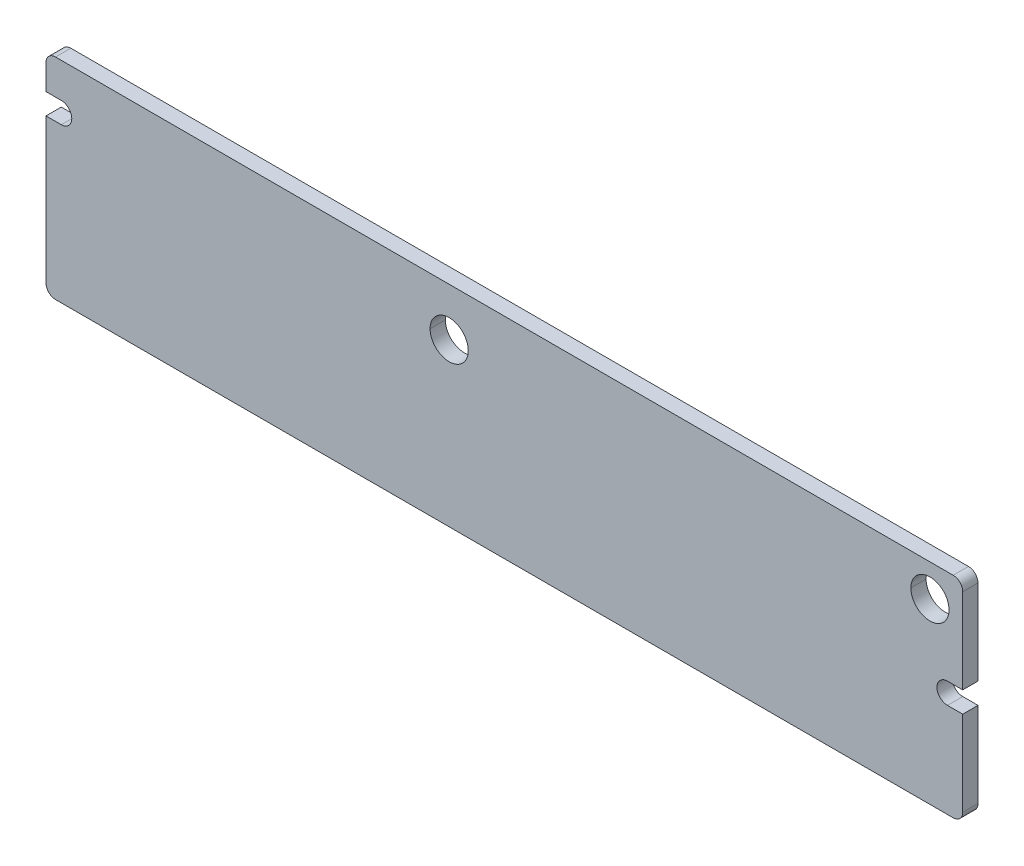
ISO-10303-21;
HEADER;
FILE_DESCRIPTION(('STEP AP214'),'2;1');
FILE_NAME('part.step','',(''),(''),'','','');
FILE_SCHEMA(('AUTOMOTIVE_DESIGN { 1 0 10303 214 1 1 1 1 }'));
ENDSEC;
DATA;
#1=APPLICATION_CONTEXT('core data for automotive mechanical design processes');
#2=APPLICATION_PROTOCOL_DEFINITION('international standard','automotive_design',2000,#1);
#3=PRODUCT_CONTEXT('',#1,'mechanical');
#4=PRODUCT('Part','Part','',(#3));
#5=PRODUCT_RELATED_PRODUCT_CATEGORY('part','',(#4));
#6=PRODUCT_DEFINITION_FORMATION('','',#4);
#7=PRODUCT_DEFINITION_CONTEXT('part definition',#1,'design');
#8=PRODUCT_DEFINITION('design','',#6,#7);
#9=PRODUCT_DEFINITION_SHAPE('','',#8);
#10=(LENGTH_UNIT() NAMED_UNIT(*) SI_UNIT(.MILLI.,.METRE.));
#11=(NAMED_UNIT(*) PLANE_ANGLE_UNIT() SI_UNIT($,.RADIAN.));
#12=(NAMED_UNIT(*) SI_UNIT($,.STERADIAN.) SOLID_ANGLE_UNIT());
#13=UNCERTAINTY_MEASURE_WITH_UNIT(LENGTH_MEASURE(1.E-05),#10,'distance_accuracy_value','');
#14=(GEOMETRIC_REPRESENTATION_CONTEXT(3) GLOBAL_UNCERTAINTY_ASSIGNED_CONTEXT((#13)) GLOBAL_UNIT_ASSIGNED_CONTEXT((#10,
#11,#12)) REPRESENTATION_CONTEXT('',''));
#15=CARTESIAN_POINT('',(0.,0.,0.));
#16=DIRECTION('',(0.,0.,1.));
#17=DIRECTION('',(1.,0.,0.));
#18=AXIS2_PLACEMENT_3D('',#15,#16,#17);
#19=CARTESIAN_POINT('',(0.,0.,0.));
#20=DIRECTION('',(0.,0.,1.));
#21=DIRECTION('',(1.,0.,0.));
#22=AXIS2_PLACEMENT_3D('',#19,#20,#21);
#23=CYLINDRICAL_SURFACE('',#22,1.);
#24=DIRECTION('',(0.,0.,1.));
#25=VECTOR('',#24,1.);
#26=CARTESIAN_POINT('',(-1.,0.,0.));
#27=LINE('',#26,#25);
#28=CARTESIAN_POINT('',(-1.,0.,0.));
#29=VERTEX_POINT('',#28);
#30=CARTESIAN_POINT('',(-1.,0.,0.8));
#31=VERTEX_POINT('',#30);
#32=EDGE_CURVE('E11',#29,#31,#27,.T.);
#33=ORIENTED_EDGE('',*,*,#32,.T.);
#34=CARTESIAN_POINT('',(0.,0.,0.8));
#35=DIRECTION('',(0.,0.,1.));
#36=DIRECTION('',(-1.,0.,0.));
#37=AXIS2_PLACEMENT_3D('',#34,#35,#36);
#38=CIRCLE('',#37,1.);
#39=CARTESIAN_POINT('',(1.,0.,0.8));
#40=VERTEX_POINT('',#39);
#41=EDGE_CURVE('E280',#31,#40,#38,.T.);
#42=ORIENTED_EDGE('',*,*,#41,.T.);
#43=DIRECTION('',(0.,0.,1.));
#44=VECTOR('',#43,1.);
#45=CARTESIAN_POINT('',(1.,0.,0.));
#46=LINE('',#45,#44);
#47=CARTESIAN_POINT('',(1.,0.,0.));
#48=VERTEX_POINT('',#47);
#49=EDGE_CURVE('E28',#48,#40,#46,.T.);
#50=ORIENTED_EDGE('',*,*,#49,.F.);
#51=CARTESIAN_POINT('',(0.,0.,0.));
#52=DIRECTION('',(0.,0.,1.));
#53=DIRECTION('',(-1.,0.,0.));
#54=AXIS2_PLACEMENT_3D('',#51,#52,#53);
#55=CIRCLE('',#54,1.);
#56=EDGE_CURVE('E244',#29,#48,#55,.T.);
#57=ORIENTED_EDGE('',*,*,#56,.F.);
#58=EDGE_LOOP('',(#33,#42,#50,#57));
#59=FACE_BOUND('',#58,.T.);
#60=ADVANCED_FACE('F17',(#59),#23,.F.);
#61=CARTESIAN_POINT('',(0.,0.,0.));
#62=DIRECTION('',(0.,0.,1.));
#63=DIRECTION('',(1.,0.,0.));
#64=AXIS2_PLACEMENT_3D('',#61,#62,#63);
#65=CYLINDRICAL_SURFACE('',#64,1.);
#66=ORIENTED_EDGE('',*,*,#49,.T.);
#67=CARTESIAN_POINT('',(0.,0.,0.8));
#68=DIRECTION('',(0.,0.,1.));
#69=DIRECTION('',(1.,0.,0.));
#70=AXIS2_PLACEMENT_3D('',#67,#68,#69);
#71=CIRCLE('',#70,1.);
#72=EDGE_CURVE('E267',#40,#31,#71,.T.);
#73=ORIENTED_EDGE('',*,*,#72,.T.);
#74=ORIENTED_EDGE('',*,*,#32,.F.);
#75=CARTESIAN_POINT('',(0.,0.,0.));
#76=DIRECTION('',(0.,0.,1.));
#77=DIRECTION('',(1.,0.,0.));
#78=AXIS2_PLACEMENT_3D('',#75,#76,#77);
#79=CIRCLE('',#78,1.);
#80=EDGE_CURVE('E239',#48,#29,#79,.T.);
#81=ORIENTED_EDGE('',*,*,#80,.F.);
#82=EDGE_LOOP('',(#66,#73,#74,#81));
#83=FACE_BOUND('',#82,.T.);
#84=ADVANCED_FACE('F378',(#83),#65,.F.);
#85=CARTESIAN_POINT('',(-25.173,-0.831,0.));
#86=DIRECTION('',(0.,0.,1.));
#87=DIRECTION('',(1.,0.,0.));
#88=AXIS2_PLACEMENT_3D('',#85,#86,#87);
#89=CYLINDRICAL_SURFACE('',#88,1.);
#90=DIRECTION('',(0.,0.,1.));
#91=VECTOR('',#90,1.);
#92=CARTESIAN_POINT('',(-26.173,-0.831,0.));
#93=LINE('',#92,#91);
#94=CARTESIAN_POINT('',(-26.173,-0.831,0.));
#95=VERTEX_POINT('',#94);
#96=CARTESIAN_POINT('',(-26.173,-0.831,0.8));
#97=VERTEX_POINT('',#96);
#98=EDGE_CURVE('E266',#95,#97,#93,.T.);
#99=ORIENTED_EDGE('',*,*,#98,.T.);
#100=CARTESIAN_POINT('',(-25.173,-0.831,0.8));
#101=DIRECTION('',(0.,0.,1.));
#102=DIRECTION('',(-1.,0.,0.));
#103=AXIS2_PLACEMENT_3D('',#100,#101,#102);
#104=CIRCLE('',#103,1.);
#105=CARTESIAN_POINT('',(-24.173,-0.831,0.8));
#106=VERTEX_POINT('',#105);
#107=EDGE_CURVE('E281',#97,#106,#104,.T.);
#108=ORIENTED_EDGE('',*,*,#107,.T.);
#109=DIRECTION('',(0.,0.,1.));
#110=VECTOR('',#109,1.);
#111=CARTESIAN_POINT('',(-24.173,-0.831,0.));
#112=LINE('',#111,#110);
#113=CARTESIAN_POINT('',(-24.173,-0.831,0.));
#114=VERTEX_POINT('',#113);
#115=EDGE_CURVE('E263',#114,#106,#112,.T.);
#116=ORIENTED_EDGE('',*,*,#115,.F.);
#117=CARTESIAN_POINT('',(-25.173,-0.831,0.));
#118=DIRECTION('',(0.,0.,1.));
#119=DIRECTION('',(-1.,0.,0.));
#120=AXIS2_PLACEMENT_3D('',#117,#118,#119);
#121=CIRCLE('',#120,1.);
#122=EDGE_CURVE('E301',#95,#114,#121,.T.);
#123=ORIENTED_EDGE('',*,*,#122,.F.);
#124=EDGE_LOOP('',(#99,#108,#116,#123));
#125=FACE_BOUND('',#124,.T.);
#126=ADVANCED_FACE('F501',(#125),#89,.F.);
#127=CARTESIAN_POINT('',(-25.173,-0.831,0.));
#128=DIRECTION('',(0.,0.,1.));
#129=DIRECTION('',(1.,0.,0.));
#130=AXIS2_PLACEMENT_3D('',#127,#128,#129);
#131=CYLINDRICAL_SURFACE('',#130,1.);
#132=ORIENTED_EDGE('',*,*,#115,.T.);
#133=CARTESIAN_POINT('',(-25.173,-0.831,0.8));
#134=DIRECTION('',(0.,0.,1.));
#135=DIRECTION('',(1.,0.,0.));
#136=AXIS2_PLACEMENT_3D('',#133,#134,#135);
#137=CIRCLE('',#136,1.);
#138=EDGE_CURVE('E276',#106,#97,#137,.T.);
#139=ORIENTED_EDGE('',*,*,#138,.T.);
#140=ORIENTED_EDGE('',*,*,#98,.F.);
#141=CARTESIAN_POINT('',(-25.173,-0.831,0.));
#142=DIRECTION('',(0.,0.,1.));
#143=DIRECTION('',(1.,0.,0.));
#144=AXIS2_PLACEMENT_3D('',#141,#142,#143);
#145=CIRCLE('',#144,1.);
#146=EDGE_CURVE('E305',#114,#95,#145,.T.);
#147=ORIENTED_EDGE('',*,*,#146,.F.);
#148=EDGE_LOOP('',(#132,#139,#140,#147));
#149=FACE_BOUND('',#148,.T.);
#150=ADVANCED_FACE('F517',(#149),#131,.F.);
#151=CARTESIAN_POINT('',(0.,0.,0.8));
#152=DIRECTION('',(0.,0.,1.));
#153=DIRECTION('',(1.,0.,0.));
#154=AXIS2_PLACEMENT_3D('',#151,#152,#153);
#155=PLANE('',#154);
#156=ORIENTED_EDGE('',*,*,#41,.F.);
#157=ORIENTED_EDGE('',*,*,#72,.F.);
#158=EDGE_LOOP('',(#156,#157));
#159=FACE_BOUND('',#158,.T.);
#160=ORIENTED_EDGE('',*,*,#107,.F.);
#161=ORIENTED_EDGE('',*,*,#138,.F.);
#162=EDGE_LOOP('',(#160,#161));
#163=FACE_BOUND('',#162,.T.);
#164=DIRECTION('',(-1.,0.,0.));
#165=VECTOR('',#164,1.);
#166=CARTESIAN_POINT('',(1.717,-4.367,0.8));
#167=LINE('',#166,#165);
#168=CARTESIAN_POINT('',(1.717,-4.367,0.8));
#169=VERTEX_POINT('',#168);
#170=CARTESIAN_POINT('',(0.917,-4.367,0.8));
#171=VERTEX_POINT('',#170);
#172=EDGE_CURVE('E290',#169,#171,#167,.T.);
#173=ORIENTED_EDGE('',*,*,#172,.T.);
#174=CARTESIAN_POINT('',(0.917,-3.817,0.8));
#175=DIRECTION('',(0.,0.,-1.));
#176=DIRECTION('',(0.,-1.,0.));
#177=AXIS2_PLACEMENT_3D('',#174,#175,#176);
#178=CIRCLE('',#177,0.55);
#179=CARTESIAN_POINT('',(0.917,-3.267,0.8));
#180=VERTEX_POINT('',#179);
#181=EDGE_CURVE('E102',#171,#180,#178,.T.);
#182=ORIENTED_EDGE('',*,*,#181,.T.);
#183=DIRECTION('',(1.,0.,0.));
#184=VECTOR('',#183,1.);
#185=CARTESIAN_POINT('',(0.917,-3.267,0.8));
#186=LINE('',#185,#184);
#187=CARTESIAN_POINT('',(1.717,-3.267,0.8));
#188=VERTEX_POINT('',#187);
#189=EDGE_CURVE('E111',#180,#188,#186,.T.);
#190=ORIENTED_EDGE('',*,*,#189,.T.);
#191=DIRECTION('',(0.,1.,0.));
#192=VECTOR('',#191,1.);
#193=CARTESIAN_POINT('',(1.717,-3.267,0.8));
#194=LINE('',#193,#192);
#195=CARTESIAN_POINT('',(1.717,1.183,0.8));
#196=VERTEX_POINT('',#195);
#197=EDGE_CURVE('E271',#188,#196,#194,.T.);
#198=ORIENTED_EDGE('',*,*,#197,.T.);
#199=CARTESIAN_POINT('',(1.217,1.183,0.8));
#200=DIRECTION('',(0.,0.,1.));
#201=DIRECTION('',(1.,0.,0.));
#202=AXIS2_PLACEMENT_3D('',#199,#200,#201);
#203=CIRCLE('',#202,0.5);
#204=CARTESIAN_POINT('',(1.217,1.683,0.8));
#205=VERTEX_POINT('',#204);
#206=EDGE_CURVE('E245',#196,#205,#203,.T.);
#207=ORIENTED_EDGE('',*,*,#206,.T.);
#208=DIRECTION('',(-1.,0.,0.));
#209=VECTOR('',#208,1.);
#210=CARTESIAN_POINT('',(1.217,1.683,0.8));
#211=LINE('',#210,#209);
#212=CARTESIAN_POINT('',(-45.783,1.683,0.8));
#213=VERTEX_POINT('',#212);
#214=EDGE_CURVE('E211',#205,#213,#211,.T.);
#215=ORIENTED_EDGE('',*,*,#214,.T.);
#216=CARTESIAN_POINT('',(-45.783,1.183,0.8));
#217=DIRECTION('',(0.,0.,1.));
#218=DIRECTION('',(0.,1.,0.));
#219=AXIS2_PLACEMENT_3D('',#216,#217,#218);
#220=CIRCLE('',#219,0.5);
#221=CARTESIAN_POINT('',(-46.283,1.183,0.8));
#222=VERTEX_POINT('',#221);
#223=EDGE_CURVE('E207',#213,#222,#220,.T.);
#224=ORIENTED_EDGE('',*,*,#223,.T.);
#225=DIRECTION('',(0.,-1.,0.));
#226=VECTOR('',#225,1.);
#227=CARTESIAN_POINT('',(-46.283,1.183,0.8));
#228=LINE('',#227,#226);
#229=CARTESIAN_POINT('',(-46.283,-0.137,0.8));
#230=VERTEX_POINT('',#229);
#231=EDGE_CURVE('E284',#222,#230,#228,.T.);
#232=ORIENTED_EDGE('',*,*,#231,.T.);
#233=DIRECTION('',(1.,0.,0.));
#234=VECTOR('',#233,1.);
#235=CARTESIAN_POINT('',(-46.283,-0.137,0.8));
#236=LINE('',#235,#234);
#237=CARTESIAN_POINT('',(-45.483,-0.137,0.8));
#238=VERTEX_POINT('',#237);
#239=EDGE_CURVE('E258',#230,#238,#236,.T.);
#240=ORIENTED_EDGE('',*,*,#239,.T.);
#241=CARTESIAN_POINT('',(-45.483,-0.687,0.8));
#242=DIRECTION('',(0.,0.,-1.));
#243=DIRECTION('',(0.,1.,0.));
#244=AXIS2_PLACEMENT_3D('',#241,#242,#243);
#245=CIRCLE('',#244,0.55);
#246=CARTESIAN_POINT('',(-45.483,-1.237,0.8));
#247=VERTEX_POINT('',#246);
#248=EDGE_CURVE('E310',#238,#247,#245,.T.);
#249=ORIENTED_EDGE('',*,*,#248,.T.);
#250=DIRECTION('',(-1.,0.,0.));
#251=VECTOR('',#250,1.);
#252=CARTESIAN_POINT('',(-45.483,-1.237,0.8));
#253=LINE('',#252,#251);
#254=CARTESIAN_POINT('',(-46.283,-1.237,0.8));
#255=VERTEX_POINT('',#254);
#256=EDGE_CURVE('E21',#247,#255,#253,.T.);
#257=ORIENTED_EDGE('',*,*,#256,.T.);
#258=DIRECTION('',(0.,-1.,0.));
#259=VECTOR('',#258,1.);
#260=CARTESIAN_POINT('',(-46.283,-1.237,0.8));
#261=LINE('',#260,#259);
#262=CARTESIAN_POINT('',(-46.283,-8.817,0.8));
#263=VERTEX_POINT('',#262);
#264=EDGE_CURVE('E396',#255,#263,#261,.T.);
#265=ORIENTED_EDGE('',*,*,#264,.T.);
#266=CARTESIAN_POINT('',(-45.783,-8.817,0.8));
#267=DIRECTION('',(0.,0.,1.));
#268=DIRECTION('',(-1.,0.,0.));
#269=AXIS2_PLACEMENT_3D('',#266,#267,#268);
#270=CIRCLE('',#269,0.5);
#271=CARTESIAN_POINT('',(-45.783,-9.317,0.8));
#272=VERTEX_POINT('',#271);
#273=EDGE_CURVE('E365',#263,#272,#270,.T.);
#274=ORIENTED_EDGE('',*,*,#273,.T.);
#275=DIRECTION('',(1.,0.,0.));
#276=VECTOR('',#275,1.);
#277=CARTESIAN_POINT('',(-45.783,-9.317,0.8));
#278=LINE('',#277,#276);
#279=CARTESIAN_POINT('',(1.217,-9.317,0.8));
#280=VERTEX_POINT('',#279);
#281=EDGE_CURVE('E319',#272,#280,#278,.T.);
#282=ORIENTED_EDGE('',*,*,#281,.T.);
#283=CARTESIAN_POINT('',(1.217,-8.817,0.8));
#284=DIRECTION('',(0.,0.,1.));
#285=DIRECTION('',(0.,-1.,0.));
#286=AXIS2_PLACEMENT_3D('',#283,#284,#285);
#287=CIRCLE('',#286,0.5);
#288=CARTESIAN_POINT('',(1.717,-8.817,0.8));
#289=VERTEX_POINT('',#288);
#290=EDGE_CURVE('E320',#280,#289,#287,.T.);
#291=ORIENTED_EDGE('',*,*,#290,.T.);
#292=DIRECTION('',(0.,1.,0.));
#293=VECTOR('',#292,1.);
#294=CARTESIAN_POINT('',(1.717,-8.817,0.8));
#295=LINE('',#294,#293);
#296=EDGE_CURVE('E325',#289,#169,#295,.T.);
#297=ORIENTED_EDGE('',*,*,#296,.T.);
#298=EDGE_LOOP('',(#173,#182,#190,#198,#207,#215,#224,#232,#240,#249,#257,#265,#274,#282,#291,#297));
#299=FACE_BOUND('',#298,.T.);
#300=ADVANCED_FACE('F376',(#159,#163,#299),#155,.T.);
#301=CARTESIAN_POINT('',(1.717,-4.367,0.));
#302=DIRECTION('',(0.,1.,0.));
#303=DIRECTION('',(1.,0.,0.));
#304=AXIS2_PLACEMENT_3D('',#301,#302,#303);
#305=PLANE('',#304);
#306=DIRECTION('',(0.,0.,1.));
#307=VECTOR('',#306,1.);
#308=CARTESIAN_POINT('',(0.917,-4.367,0.));
#309=LINE('',#308,#307);
#310=CARTESIAN_POINT('',(0.917,-4.367,0.));
#311=VERTEX_POINT('',#310);
#312=EDGE_CURVE('E286',#311,#171,#309,.T.);
#313=ORIENTED_EDGE('',*,*,#312,.T.);
#314=ORIENTED_EDGE('',*,*,#172,.F.);
#315=DIRECTION('',(0.,0.,1.));
#316=VECTOR('',#315,1.);
#317=CARTESIAN_POINT('',(1.717,-4.367,0.));
#318=LINE('',#317,#316);
#319=CARTESIAN_POINT('',(1.717,-4.367,0.));
#320=VERTEX_POINT('',#319);
#321=EDGE_CURVE('E243',#320,#169,#318,.T.);
#322=ORIENTED_EDGE('',*,*,#321,.F.);
#323=DIRECTION('',(-1.,0.,0.));
#324=VECTOR('',#323,1.);
#325=CARTESIAN_POINT('',(1.717,-4.367,0.));
#326=LINE('',#325,#324);
#327=EDGE_CURVE('E295',#320,#311,#326,.T.);
#328=ORIENTED_EDGE('',*,*,#327,.T.);
#329=EDGE_LOOP('',(#313,#314,#322,#328));
#330=FACE_BOUND('',#329,.T.);
#331=ADVANCED_FACE('F472',(#330),#305,.T.);
#332=CARTESIAN_POINT('',(0.917,-3.817,0.));
#333=DIRECTION('',(0.,0.,1.));
#334=DIRECTION('',(1.,0.,0.));
#335=AXIS2_PLACEMENT_3D('',#332,#333,#334);
#336=CYLINDRICAL_SURFACE('',#335,0.55);
#337=DIRECTION('',(0.,0.,1.));
#338=VECTOR('',#337,1.);
#339=CARTESIAN_POINT('',(0.917,-3.267,0.));
#340=LINE('',#339,#338);
#341=CARTESIAN_POINT('',(0.917,-3.267,0.));
#342=VERTEX_POINT('',#341);
#343=EDGE_CURVE('E249',#342,#180,#340,.T.);
#344=ORIENTED_EDGE('',*,*,#343,.T.);
#345=ORIENTED_EDGE('',*,*,#181,.F.);
#346=ORIENTED_EDGE('',*,*,#312,.F.);
#347=CARTESIAN_POINT('',(0.917,-3.817,0.));
#348=DIRECTION('',(0.,0.,-1.));
#349=DIRECTION('',(0.,-1.,0.));
#350=AXIS2_PLACEMENT_3D('',#347,#348,#349);
#351=CIRCLE('',#350,0.55);
#352=EDGE_CURVE('E291',#311,#342,#351,.T.);
#353=ORIENTED_EDGE('',*,*,#352,.T.);
#354=EDGE_LOOP('',(#344,#345,#346,#353));
#355=FACE_BOUND('',#354,.T.);
#356=ADVANCED_FACE('F475',(#355),#336,.F.);
#357=CARTESIAN_POINT('',(0.917,-3.267,0.));
#358=DIRECTION('',(0.,-1.,0.));
#359=DIRECTION('',(0.,0.,-1.));
#360=AXIS2_PLACEMENT_3D('',#357,#358,#359);
#361=PLANE('',#360);
#362=DIRECTION('',(0.,0.,1.));
#363=VECTOR('',#362,1.);
#364=CARTESIAN_POINT('',(1.717,-3.267,0.));
#365=LINE('',#364,#363);
#366=CARTESIAN_POINT('',(1.717,-3.267,0.));
#367=VERTEX_POINT('',#366);
#368=EDGE_CURVE('E268',#367,#188,#365,.T.);
#369=ORIENTED_EDGE('',*,*,#368,.T.);
#370=ORIENTED_EDGE('',*,*,#189,.F.);
#371=ORIENTED_EDGE('',*,*,#343,.F.);
#372=DIRECTION('',(1.,0.,0.));
#373=VECTOR('',#372,1.);
#374=CARTESIAN_POINT('',(0.917,-3.267,0.));
#375=LINE('',#374,#373);
#376=EDGE_CURVE('E296',#342,#367,#375,.T.);
#377=ORIENTED_EDGE('',*,*,#376,.T.);
#378=EDGE_LOOP('',(#369,#370,#371,#377));
#379=FACE_BOUND('',#378,.T.);
#380=ADVANCED_FACE('F478',(#379),#361,.T.);
#381=CARTESIAN_POINT('',(1.717,-3.267,0.));
#382=DIRECTION('',(1.,0.,0.));
#383=DIRECTION('',(0.,1.,0.));
#384=AXIS2_PLACEMENT_3D('',#381,#382,#383);
#385=PLANE('',#384);
#386=DIRECTION('',(0.,0.,1.));
#387=VECTOR('',#386,1.);
#388=CARTESIAN_POINT('',(1.717,1.183,0.));
#389=LINE('',#388,#387);
#390=CARTESIAN_POINT('',(1.717,1.183,0.));
#391=VERTEX_POINT('',#390);
#392=EDGE_CURVE('E248',#391,#196,#389,.T.);
#393=ORIENTED_EDGE('',*,*,#392,.T.);
#394=ORIENTED_EDGE('',*,*,#197,.F.);
#395=ORIENTED_EDGE('',*,*,#368,.F.);
#396=DIRECTION('',(0.,1.,0.));
#397=VECTOR('',#396,1.);
#398=CARTESIAN_POINT('',(1.717,-3.267,0.));
#399=LINE('',#398,#397);
#400=EDGE_CURVE('E309',#367,#391,#399,.T.);
#401=ORIENTED_EDGE('',*,*,#400,.T.);
#402=EDGE_LOOP('',(#393,#394,#395,#401));
#403=FACE_BOUND('',#402,.T.);
#404=ADVANCED_FACE('F482',(#403),#385,.T.);
#405=CARTESIAN_POINT('',(1.217,1.183,0.));
#406=DIRECTION('',(0.,0.,1.));
#407=DIRECTION('',(1.,0.,0.));
#408=AXIS2_PLACEMENT_3D('',#405,#406,#407);
#409=CYLINDRICAL_SURFACE('',#408,0.5);
#410=DIRECTION('',(0.,0.,1.));
#411=VECTOR('',#410,1.);
#412=CARTESIAN_POINT('',(1.217,1.683,0.));
#413=LINE('',#412,#411);
#414=CARTESIAN_POINT('',(1.217,1.683,0.));
#415=VERTEX_POINT('',#414);
#416=EDGE_CURVE('E216',#415,#205,#413,.T.);
#417=ORIENTED_EDGE('',*,*,#416,.T.);
#418=ORIENTED_EDGE('',*,*,#206,.F.);
#419=ORIENTED_EDGE('',*,*,#392,.F.);
#420=CARTESIAN_POINT('',(1.217,1.183,0.));
#421=DIRECTION('',(0.,0.,1.));
#422=DIRECTION('',(1.,0.,0.));
#423=AXIS2_PLACEMENT_3D('',#420,#421,#422);
#424=CIRCLE('',#423,0.5);
#425=EDGE_CURVE('E221',#391,#415,#424,.T.);
#426=ORIENTED_EDGE('',*,*,#425,.T.);
#427=EDGE_LOOP('',(#417,#418,#419,#426));
#428=FACE_BOUND('',#427,.T.);
#429=ADVANCED_FACE('F485',(#428),#409,.T.);
#430=CARTESIAN_POINT('',(1.217,1.683,0.));
#431=DIRECTION('',(0.,1.,0.));
#432=DIRECTION('',(1.,0.,0.));
#433=AXIS2_PLACEMENT_3D('',#430,#431,#432);
#434=PLANE('',#433);
#435=DIRECTION('',(0.,0.,1.));
#436=VECTOR('',#435,1.);
#437=CARTESIAN_POINT('',(-45.783,1.683,0.));
#438=LINE('',#437,#436);
#439=CARTESIAN_POINT('',(-45.783,1.683,0.));
#440=VERTEX_POINT('',#439);
#441=EDGE_CURVE('E200',#440,#213,#438,.T.);
#442=ORIENTED_EDGE('',*,*,#441,.T.);
#443=ORIENTED_EDGE('',*,*,#214,.F.);
#444=ORIENTED_EDGE('',*,*,#416,.F.);
#445=DIRECTION('',(-1.,0.,0.));
#446=VECTOR('',#445,1.);
#447=CARTESIAN_POINT('',(1.217,1.683,0.));
#448=LINE('',#447,#446);
#449=EDGE_CURVE('E214',#415,#440,#448,.T.);
#450=ORIENTED_EDGE('',*,*,#449,.T.);
#451=EDGE_LOOP('',(#442,#443,#444,#450));
#452=FACE_BOUND('',#451,.T.);
#453=ADVANCED_FACE('F19',(#452),#434,.T.);
#454=CARTESIAN_POINT('',(-45.783,1.183,0.));
#455=DIRECTION('',(0.,0.,1.));
#456=DIRECTION('',(1.,0.,0.));
#457=AXIS2_PLACEMENT_3D('',#454,#455,#456);
#458=CYLINDRICAL_SURFACE('',#457,0.5);
#459=DIRECTION('',(0.,0.,1.));
#460=VECTOR('',#459,1.);
#461=CARTESIAN_POINT('',(-46.283,1.183,0.));
#462=LINE('',#461,#460);
#463=CARTESIAN_POINT('',(-46.283,1.183,0.));
#464=VERTEX_POINT('',#463);
#465=EDGE_CURVE('E334',#464,#222,#462,.T.);
#466=ORIENTED_EDGE('',*,*,#465,.T.);
#467=ORIENTED_EDGE('',*,*,#223,.F.);
#468=ORIENTED_EDGE('',*,*,#441,.F.);
#469=CARTESIAN_POINT('',(-45.783,1.183,0.));
#470=DIRECTION('',(0.,0.,1.));
#471=DIRECTION('',(0.,1.,0.));
#472=AXIS2_PLACEMENT_3D('',#469,#470,#471);
#473=CIRCLE('',#472,0.5);
#474=EDGE_CURVE('E205',#440,#464,#473,.T.);
#475=ORIENTED_EDGE('',*,*,#474,.T.);
#476=EDGE_LOOP('',(#466,#467,#468,#475));
#477=FACE_BOUND('',#476,.T.);
#478=ADVANCED_FACE('F203',(#477),#458,.T.);
#479=CARTESIAN_POINT('',(-46.283,1.183,0.));
#480=DIRECTION('',(-1.,0.,0.));
#481=DIRECTION('',(0.,0.,1.));
#482=AXIS2_PLACEMENT_3D('',#479,#480,#481);
#483=PLANE('',#482);
#484=DIRECTION('',(0.,0.,1.));
#485=VECTOR('',#484,1.);
#486=CARTESIAN_POINT('',(-46.283,-0.137,0.));
#487=LINE('',#486,#485);
#488=CARTESIAN_POINT('',(-46.283,-0.137,0.));
#489=VERTEX_POINT('',#488);
#490=EDGE_CURVE('E261',#489,#230,#487,.T.);
#491=ORIENTED_EDGE('',*,*,#490,.T.);
#492=ORIENTED_EDGE('',*,*,#231,.F.);
#493=ORIENTED_EDGE('',*,*,#465,.F.);
#494=DIRECTION('',(0.,-1.,0.));
#495=VECTOR('',#494,1.);
#496=CARTESIAN_POINT('',(-46.283,1.183,0.));
#497=LINE('',#496,#495);
#498=EDGE_CURVE('E227',#464,#489,#497,.T.);
#499=ORIENTED_EDGE('',*,*,#498,.T.);
#500=EDGE_LOOP('',(#491,#492,#493,#499));
#501=FACE_BOUND('',#500,.T.);
#502=ADVANCED_FACE('F520',(#501),#483,.T.);
#503=CARTESIAN_POINT('',(-46.283,-0.137,0.));
#504=DIRECTION('',(0.,-1.,0.));
#505=DIRECTION('',(0.,0.,-1.));
#506=AXIS2_PLACEMENT_3D('',#503,#504,#505);
#507=PLANE('',#506);
#508=DIRECTION('',(0.,0.,1.));
#509=VECTOR('',#508,1.);
#510=CARTESIAN_POINT('',(-45.483,-0.137,0.));
#511=LINE('',#510,#509);
#512=CARTESIAN_POINT('',(-45.483,-0.137,0.));
#513=VERTEX_POINT('',#512);
#514=EDGE_CURVE('E262',#513,#238,#511,.T.);
#515=ORIENTED_EDGE('',*,*,#514,.T.);
#516=ORIENTED_EDGE('',*,*,#239,.F.);
#517=ORIENTED_EDGE('',*,*,#490,.F.);
#518=DIRECTION('',(1.,0.,0.));
#519=VECTOR('',#518,1.);
#520=CARTESIAN_POINT('',(-46.283,-0.137,0.));
#521=LINE('',#520,#519);
#522=EDGE_CURVE('E233',#489,#513,#521,.T.);
#523=ORIENTED_EDGE('',*,*,#522,.T.);
#524=EDGE_LOOP('',(#515,#516,#517,#523));
#525=FACE_BOUND('',#524,.T.);
#526=ADVANCED_FACE('F522',(#525),#507,.T.);
#527=CARTESIAN_POINT('',(-45.483,-0.687,0.));
#528=DIRECTION('',(0.,0.,1.));
#529=DIRECTION('',(1.,0.,0.));
#530=AXIS2_PLACEMENT_3D('',#527,#528,#529);
#531=CYLINDRICAL_SURFACE('',#530,0.55);
#532=DIRECTION('',(0.,0.,1.));
#533=VECTOR('',#532,1.);
#534=CARTESIAN_POINT('',(-45.483,-1.237,0.));
#535=LINE('',#534,#533);
#536=CARTESIAN_POINT('',(-45.483,-1.237,0.));
#537=VERTEX_POINT('',#536);
#538=EDGE_CURVE('E314',#537,#247,#535,.T.);
#539=ORIENTED_EDGE('',*,*,#538,.T.);
#540=ORIENTED_EDGE('',*,*,#248,.F.);
#541=ORIENTED_EDGE('',*,*,#514,.F.);
#542=CARTESIAN_POINT('',(-45.483,-0.687,0.));
#543=DIRECTION('',(0.,0.,-1.));
#544=DIRECTION('',(0.,1.,0.));
#545=AXIS2_PLACEMENT_3D('',#542,#543,#544);
#546=CIRCLE('',#545,0.55);
#547=EDGE_CURVE('E256',#513,#537,#546,.T.);
#548=ORIENTED_EDGE('',*,*,#547,.T.);
#549=EDGE_LOOP('',(#539,#540,#541,#548));
#550=FACE_BOUND('',#549,.T.);
#551=ADVANCED_FACE('F524',(#550),#531,.F.);
#552=CARTESIAN_POINT('',(-45.483,-1.237,0.));
#553=DIRECTION('',(0.,1.,0.));
#554=DIRECTION('',(1.,0.,0.));
#555=AXIS2_PLACEMENT_3D('',#552,#553,#554);
#556=PLANE('',#555);
#557=DIRECTION('',(0.,0.,1.));
#558=VECTOR('',#557,1.);
#559=CARTESIAN_POINT('',(-46.283,-1.237,0.));
#560=LINE('',#559,#558);
#561=CARTESIAN_POINT('',(-46.283,-1.237,0.));
#562=VERTEX_POINT('',#561);
#563=EDGE_CURVE('E405',#562,#255,#560,.T.);
#564=ORIENTED_EDGE('',*,*,#563,.T.);
#565=ORIENTED_EDGE('',*,*,#256,.F.);
#566=ORIENTED_EDGE('',*,*,#538,.F.);
#567=DIRECTION('',(-1.,0.,0.));
#568=VECTOR('',#567,1.);
#569=CARTESIAN_POINT('',(-45.483,-1.237,0.));
#570=LINE('',#569,#568);
#571=EDGE_CURVE('E252',#537,#562,#570,.T.);
#572=ORIENTED_EDGE('',*,*,#571,.T.);
#573=EDGE_LOOP('',(#564,#565,#566,#572));
#574=FACE_BOUND('',#573,.T.);
#575=ADVANCED_FACE('F437',(#574),#556,.T.);
#576=CARTESIAN_POINT('',(-46.283,-1.237,0.));
#577=DIRECTION('',(-1.,0.,0.));
#578=DIRECTION('',(0.,0.,1.));
#579=AXIS2_PLACEMENT_3D('',#576,#577,#578);
#580=PLANE('',#579);
#581=DIRECTION('',(0.,0.,1.));
#582=VECTOR('',#581,1.);
#583=CARTESIAN_POINT('',(-46.283,-8.817,0.));
#584=LINE('',#583,#582);
#585=CARTESIAN_POINT('',(-46.283,-8.817,0.));
#586=VERTEX_POINT('',#585);
#587=EDGE_CURVE('E393',#586,#263,#584,.T.);
#588=ORIENTED_EDGE('',*,*,#587,.T.);
#589=ORIENTED_EDGE('',*,*,#264,.F.);
#590=ORIENTED_EDGE('',*,*,#563,.F.);
#591=DIRECTION('',(0.,-1.,0.));
#592=VECTOR('',#591,1.);
#593=CARTESIAN_POINT('',(-46.283,-1.237,0.));
#594=LINE('',#593,#592);
#595=EDGE_CURVE('E257',#562,#586,#594,.T.);
#596=ORIENTED_EDGE('',*,*,#595,.T.);
#597=EDGE_LOOP('',(#588,#589,#590,#596));
#598=FACE_BOUND('',#597,.T.);
#599=ADVANCED_FACE('F441',(#598),#580,.T.);
#600=CARTESIAN_POINT('',(-45.783,-8.817,0.));
#601=DIRECTION('',(0.,0.,1.));
#602=DIRECTION('',(1.,0.,0.));
#603=AXIS2_PLACEMENT_3D('',#600,#601,#602);
#604=CYLINDRICAL_SURFACE('',#603,0.5);
#605=DIRECTION('',(0.,0.,1.));
#606=VECTOR('',#605,1.);
#607=CARTESIAN_POINT('',(-45.783,-9.317,0.));
#608=LINE('',#607,#606);
#609=CARTESIAN_POINT('',(-45.783,-9.317,0.));
#610=VERTEX_POINT('',#609);
#611=EDGE_CURVE('E353',#610,#272,#608,.T.);
#612=ORIENTED_EDGE('',*,*,#611,.T.);
#613=ORIENTED_EDGE('',*,*,#273,.F.);
#614=ORIENTED_EDGE('',*,*,#587,.F.);
#615=CARTESIAN_POINT('',(-45.783,-8.817,0.));
#616=DIRECTION('',(0.,0.,1.));
#617=DIRECTION('',(-1.,0.,0.));
#618=AXIS2_PLACEMENT_3D('',#615,#616,#617);
#619=CIRCLE('',#618,0.5);
#620=EDGE_CURVE('E236',#586,#610,#619,.T.);
#621=ORIENTED_EDGE('',*,*,#620,.T.);
#622=EDGE_LOOP('',(#612,#613,#614,#621));
#623=FACE_BOUND('',#622,.T.);
#624=ADVANCED_FACE('F455',(#623),#604,.T.);
#625=CARTESIAN_POINT('',(-45.783,-9.317,0.));
#626=DIRECTION('',(0.,-1.,0.));
#627=DIRECTION('',(0.,0.,-1.));
#628=AXIS2_PLACEMENT_3D('',#625,#626,#627);
#629=PLANE('',#628);
#630=DIRECTION('',(0.,0.,1.));
#631=VECTOR('',#630,1.);
#632=CARTESIAN_POINT('',(1.217,-9.317,0.));
#633=LINE('',#632,#631);
#634=CARTESIAN_POINT('',(1.217,-9.317,0.));
#635=VERTEX_POINT('',#634);
#636=EDGE_CURVE('E315',#635,#280,#633,.T.);
#637=ORIENTED_EDGE('',*,*,#636,.T.);
#638=ORIENTED_EDGE('',*,*,#281,.F.);
#639=ORIENTED_EDGE('',*,*,#611,.F.);
#640=DIRECTION('',(1.,0.,0.));
#641=VECTOR('',#640,1.);
#642=CARTESIAN_POINT('',(-45.783,-9.317,0.));
#643=LINE('',#642,#641);
#644=EDGE_CURVE('E347',#610,#635,#643,.T.);
#645=ORIENTED_EDGE('',*,*,#644,.T.);
#646=EDGE_LOOP('',(#637,#638,#639,#645));
#647=FACE_BOUND('',#646,.T.);
#648=ADVANCED_FACE('F463',(#647),#629,.T.);
#649=CARTESIAN_POINT('',(1.217,-8.817,0.));
#650=DIRECTION('',(0.,0.,1.));
#651=DIRECTION('',(1.,0.,0.));
#652=AXIS2_PLACEMENT_3D('',#649,#650,#651);
#653=CYLINDRICAL_SURFACE('',#652,0.5);
#654=DIRECTION('',(0.,0.,1.));
#655=VECTOR('',#654,1.);
#656=CARTESIAN_POINT('',(1.717,-8.817,0.));
#657=LINE('',#656,#655);
#658=CARTESIAN_POINT('',(1.717,-8.817,0.));
#659=VERTEX_POINT('',#658);
#660=EDGE_CURVE('E330',#659,#289,#657,.T.);
#661=ORIENTED_EDGE('',*,*,#660,.T.);
#662=ORIENTED_EDGE('',*,*,#290,.F.);
#663=ORIENTED_EDGE('',*,*,#636,.F.);
#664=CARTESIAN_POINT('',(1.217,-8.817,0.));
#665=DIRECTION('',(0.,0.,1.));
#666=DIRECTION('',(0.,-1.,0.));
#667=AXIS2_PLACEMENT_3D('',#664,#665,#666);
#668=CIRCLE('',#667,0.5);
#669=EDGE_CURVE('E343',#635,#659,#668,.T.);
#670=ORIENTED_EDGE('',*,*,#669,.T.);
#671=EDGE_LOOP('',(#661,#662,#663,#670));
#672=FACE_BOUND('',#671,.T.);
#673=ADVANCED_FACE('F460',(#672),#653,.T.);
#674=CARTESIAN_POINT('',(1.717,-8.817,0.));
#675=DIRECTION('',(1.,0.,0.));
#676=DIRECTION('',(0.,1.,0.));
#677=AXIS2_PLACEMENT_3D('',#674,#675,#676);
#678=PLANE('',#677);
#679=ORIENTED_EDGE('',*,*,#321,.T.);
#680=ORIENTED_EDGE('',*,*,#296,.F.);
#681=ORIENTED_EDGE('',*,*,#660,.F.);
#682=DIRECTION('',(0.,1.,0.));
#683=VECTOR('',#682,1.);
#684=CARTESIAN_POINT('',(1.717,-8.817,0.));
#685=LINE('',#684,#683);
#686=EDGE_CURVE('E306',#659,#320,#685,.T.);
#687=ORIENTED_EDGE('',*,*,#686,.T.);
#688=EDGE_LOOP('',(#679,#680,#681,#687));
#689=FACE_BOUND('',#688,.T.);
#690=ADVANCED_FACE('F470',(#689),#678,.T.);
#691=CARTESIAN_POINT('',(0.,0.,0.));
#692=DIRECTION('',(0.,0.,1.));
#693=DIRECTION('',(1.,0.,0.));
#694=AXIS2_PLACEMENT_3D('',#691,#692,#693);
#695=PLANE('',#694);
#696=ORIENTED_EDGE('',*,*,#56,.T.);
#697=ORIENTED_EDGE('',*,*,#80,.T.);
#698=EDGE_LOOP('',(#696,#697));
#699=FACE_BOUND('',#698,.T.);
#700=ORIENTED_EDGE('',*,*,#122,.T.);
#701=ORIENTED_EDGE('',*,*,#146,.T.);
#702=EDGE_LOOP('',(#700,#701));
#703=FACE_BOUND('',#702,.T.);
#704=ORIENTED_EDGE('',*,*,#669,.F.);
#705=ORIENTED_EDGE('',*,*,#644,.F.);
#706=ORIENTED_EDGE('',*,*,#620,.F.);
#707=ORIENTED_EDGE('',*,*,#595,.F.);
#708=ORIENTED_EDGE('',*,*,#571,.F.);
#709=ORIENTED_EDGE('',*,*,#547,.F.);
#710=ORIENTED_EDGE('',*,*,#522,.F.);
#711=ORIENTED_EDGE('',*,*,#498,.F.);
#712=ORIENTED_EDGE('',*,*,#474,.F.);
#713=ORIENTED_EDGE('',*,*,#449,.F.);
#714=ORIENTED_EDGE('',*,*,#425,.F.);
#715=ORIENTED_EDGE('',*,*,#400,.F.);
#716=ORIENTED_EDGE('',*,*,#376,.F.);
#717=ORIENTED_EDGE('',*,*,#352,.F.);
#718=ORIENTED_EDGE('',*,*,#327,.F.);
#719=ORIENTED_EDGE('',*,*,#686,.F.);
#720=EDGE_LOOP('',(#704,#705,#706,#707,#708,#709,#710,#711,#712,#713,#714,#715,#716,#717,#718,#719));
#721=FACE_BOUND('',#720,.T.);
#722=ADVANCED_FACE('F224',(#699,#703,#721),#695,.F.);
#723=CLOSED_SHELL('',(#60,#84,#126,#150,#300,#331,#356,#380,#404,#429,#453,#478,#502,#526,#551,
#575,#599,#624,#648,#673,#690,#722));
#724=MANIFOLD_SOLID_BREP('B1',#723);
#725=ADVANCED_BREP_SHAPE_REPRESENTATION('',(#18,#724),#14);
#726=SHAPE_DEFINITION_REPRESENTATION(#9,#725);
ENDSEC;
END-ISO-10303-21;
